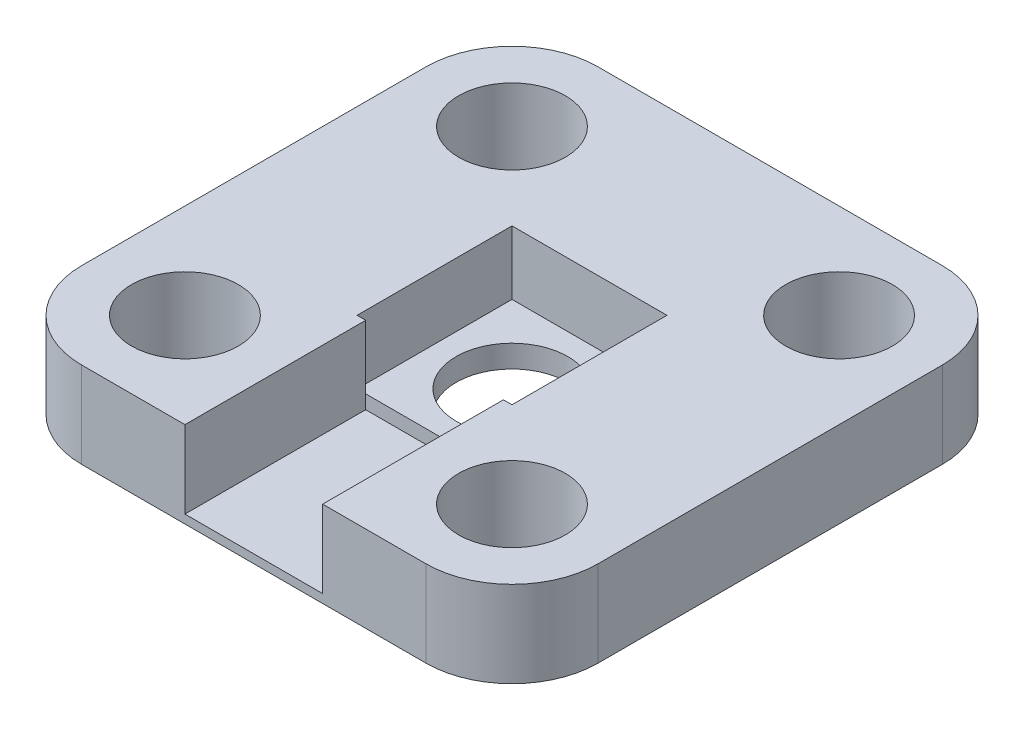
ISO-10303-21;
HEADER;
FILE_DESCRIPTION(('STEP AP214'),'2;1');
FILE_NAME('part.step','',(''),(''),'','','');
FILE_SCHEMA(('AUTOMOTIVE_DESIGN { 1 0 10303 214 1 1 1 1 }'));
ENDSEC;
DATA;
#1=APPLICATION_CONTEXT('core data for automotive mechanical design processes');
#2=APPLICATION_PROTOCOL_DEFINITION('international standard','automotive_design',2000,#1);
#3=PRODUCT_CONTEXT('',#1,'mechanical');
#4=PRODUCT('Part','Part','',(#3));
#5=PRODUCT_RELATED_PRODUCT_CATEGORY('part','',(#4));
#6=PRODUCT_DEFINITION_FORMATION('','',#4);
#7=PRODUCT_DEFINITION_CONTEXT('part definition',#1,'design');
#8=PRODUCT_DEFINITION('design','',#6,#7);
#9=PRODUCT_DEFINITION_SHAPE('','',#8);
#10=(LENGTH_UNIT() NAMED_UNIT(*) SI_UNIT(.MILLI.,.METRE.));
#11=(NAMED_UNIT(*) PLANE_ANGLE_UNIT() SI_UNIT($,.RADIAN.));
#12=(NAMED_UNIT(*) SI_UNIT($,.STERADIAN.) SOLID_ANGLE_UNIT());
#13=UNCERTAINTY_MEASURE_WITH_UNIT(LENGTH_MEASURE(1.E-05),#10,'distance_accuracy_value','');
#14=(GEOMETRIC_REPRESENTATION_CONTEXT(3) GLOBAL_UNCERTAINTY_ASSIGNED_CONTEXT((#13)) GLOBAL_UNIT_ASSIGNED_CONTEXT((#10,
#11,#12)) REPRESENTATION_CONTEXT('',''));
#15=CARTESIAN_POINT('',(0.,0.,0.));
#16=DIRECTION('',(0.,0.,1.));
#17=DIRECTION('',(1.,0.,0.));
#18=AXIS2_PLACEMENT_3D('',#15,#16,#17);
#19=CARTESIAN_POINT('',(0.,2.5,2.25));
#20=DIRECTION('',(0.,0.,-1.));
#21=DIRECTION('',(-1.,0.,0.));
#22=AXIS2_PLACEMENT_3D('',#19,#20,#21);
#23=PLANE('',#22);
#24=DIRECTION('',(1.,0.,0.));
#25=VECTOR('',#24,1.);
#26=CARTESIAN_POINT('',(0.,0.65,2.25));
#27=LINE('',#26,#25);
#28=CARTESIAN_POINT('',(2.,0.65,2.25));
#29=VERTEX_POINT('',#28);
#30=CARTESIAN_POINT('',(2.25,0.65,2.25));
#31=VERTEX_POINT('',#30);
#32=EDGE_CURVE('E164',#29,#31,#27,.T.);
#33=ORIENTED_EDGE('',*,*,#32,.F.);
#34=DIRECTION('',(0.,-1.,0.));
#35=VECTOR('',#34,1.);
#36=CARTESIAN_POINT('',(2.,2.5,2.25));
#37=LINE('',#36,#35);
#38=CARTESIAN_POINT('',(2.,2.5,2.25));
#39=VERTEX_POINT('',#38);
#40=EDGE_CURVE('E200',#39,#29,#37,.T.);
#41=ORIENTED_EDGE('',*,*,#40,.F.);
#42=DIRECTION('',(1.,0.,0.));
#43=VECTOR('',#42,1.);
#44=CARTESIAN_POINT('',(0.,2.5,2.25));
#45=LINE('',#44,#43);
#46=CARTESIAN_POINT('',(2.25,2.5,2.25));
#47=VERTEX_POINT('',#46);
#48=EDGE_CURVE('E283',#39,#47,#45,.T.);
#49=ORIENTED_EDGE('',*,*,#48,.T.);
#50=DIRECTION('',(0.,-1.,0.));
#51=VECTOR('',#50,1.);
#52=CARTESIAN_POINT('',(2.25,2.5,2.25));
#53=LINE('',#52,#51);
#54=EDGE_CURVE('E183',#47,#31,#53,.T.);
#55=ORIENTED_EDGE('',*,*,#54,.T.);
#56=EDGE_LOOP('',(#33,#41,#49,#55));
#57=FACE_BOUND('',#56,.T.);
#58=ADVANCED_FACE('F38',(#57),#23,.T.);
#59=CARTESIAN_POINT('',(2.,2.5,0.));
#60=DIRECTION('',(1.,0.,0.));
#61=DIRECTION('',(0.,0.,-1.));
#62=AXIS2_PLACEMENT_3D('',#59,#60,#61);
#63=PLANE('',#62);
#64=DIRECTION('',(0.,1.,0.));
#65=VECTOR('',#64,1.);
#66=CARTESIAN_POINT('',(2.,2.5,2.25));
#67=LINE('',#66,#65);
#68=CARTESIAN_POINT('',(2.,0.25,2.25));
#69=VERTEX_POINT('',#68);
#70=EDGE_CURVE('E275',#69,#29,#67,.T.);
#71=ORIENTED_EDGE('',*,*,#70,.F.);
#72=DIRECTION('',(0.,0.,1.));
#73=VECTOR('',#72,1.);
#74=CARTESIAN_POINT('',(2.,0.25,0.));
#75=LINE('',#74,#73);
#76=CARTESIAN_POINT('',(2.,0.25,7.5));
#77=VERTEX_POINT('',#76);
#78=EDGE_CURVE('E390',#69,#77,#75,.T.);
#79=ORIENTED_EDGE('',*,*,#78,.T.);
#80=DIRECTION('',(0.,-1.,0.));
#81=VECTOR('',#80,1.);
#82=CARTESIAN_POINT('',(2.,2.5,7.5));
#83=LINE('',#82,#81);
#84=CARTESIAN_POINT('',(2.,2.5,7.5));
#85=VERTEX_POINT('',#84);
#86=EDGE_CURVE('E197',#85,#77,#83,.T.);
#87=ORIENTED_EDGE('',*,*,#86,.F.);
#88=DIRECTION('',(0.,0.,1.));
#89=VECTOR('',#88,1.);
#90=CARTESIAN_POINT('',(2.,2.5,0.));
#91=LINE('',#90,#89);
#92=EDGE_CURVE('E286',#39,#85,#91,.T.);
#93=ORIENTED_EDGE('',*,*,#92,.F.);
#94=ORIENTED_EDGE('',*,*,#40,.T.);
#95=EDGE_LOOP('',(#71,#79,#87,#93,#94));
#96=FACE_BOUND('',#95,.T.);
#97=ADVANCED_FACE('F335',(#96),#63,.F.);
#98=CARTESIAN_POINT('',(7.5,2.5,0.));
#99=DIRECTION('',(1.,0.,0.));
#100=DIRECTION('',(0.,0.,-1.));
#101=AXIS2_PLACEMENT_3D('',#98,#99,#100);
#102=PLANE('',#101);
#103=DIRECTION('',(0.,0.,1.));
#104=VECTOR('',#103,1.);
#105=CARTESIAN_POINT('',(7.5,0.,0.));
#106=LINE('',#105,#104);
#107=CARTESIAN_POINT('',(7.5,0.,-5.));
#108=VERTEX_POINT('',#107);
#109=CARTESIAN_POINT('',(7.5,0.,5.));
#110=VERTEX_POINT('',#109);
#111=EDGE_CURVE('E238',#108,#110,#106,.T.);
#112=ORIENTED_EDGE('',*,*,#111,.F.);
#113=DIRECTION('',(0.,-1.,0.));
#114=VECTOR('',#113,1.);
#115=CARTESIAN_POINT('',(7.5,2.5,-5.));
#116=LINE('',#115,#114);
#117=CARTESIAN_POINT('',(7.5,2.5,-5.));
#118=VERTEX_POINT('',#117);
#119=EDGE_CURVE('E11',#108,#118,#116,.F.);
#120=ORIENTED_EDGE('',*,*,#119,.T.);
#121=DIRECTION('',(0.,0.,1.));
#122=VECTOR('',#121,1.);
#123=CARTESIAN_POINT('',(7.5,2.5,0.));
#124=LINE('',#123,#122);
#125=CARTESIAN_POINT('',(7.5,2.5,5.));
#126=VERTEX_POINT('',#125);
#127=EDGE_CURVE('E240',#118,#126,#124,.T.);
#128=ORIENTED_EDGE('',*,*,#127,.T.);
#129=DIRECTION('',(0.,-1.,0.));
#130=VECTOR('',#129,1.);
#131=CARTESIAN_POINT('',(7.5,0.,5.));
#132=LINE('',#131,#130);
#133=EDGE_CURVE('E46',#126,#110,#132,.T.);
#134=ORIENTED_EDGE('',*,*,#133,.T.);
#135=EDGE_LOOP('',(#112,#120,#128,#134));
#136=FACE_BOUND('',#135,.T.);
#137=ADVANCED_FACE('F237',(#136),#102,.T.);
#138=CARTESIAN_POINT('',(0.,2.5,-7.5));
#139=DIRECTION('',(0.,0.,-1.));
#140=DIRECTION('',(-1.,0.,0.));
#141=AXIS2_PLACEMENT_3D('',#138,#139,#140);
#142=PLANE('',#141);
#143=DIRECTION('',(1.,0.,0.));
#144=VECTOR('',#143,1.);
#145=CARTESIAN_POINT('',(0.,0.,-7.5));
#146=LINE('',#145,#144);
#147=CARTESIAN_POINT('',(-5.,0.,-7.5));
#148=VERTEX_POINT('',#147);
#149=CARTESIAN_POINT('',(5.,0.,-7.5));
#150=VERTEX_POINT('',#149);
#151=EDGE_CURVE('E249',#148,#150,#146,.T.);
#152=ORIENTED_EDGE('',*,*,#151,.F.);
#153=DIRECTION('',(0.,-1.,0.));
#154=VECTOR('',#153,1.);
#155=CARTESIAN_POINT('',(-5.,2.5,-7.5));
#156=LINE('',#155,#154);
#157=CARTESIAN_POINT('',(-5.,2.5,-7.5));
#158=VERTEX_POINT('',#157);
#159=EDGE_CURVE('E60',#148,#158,#156,.F.);
#160=ORIENTED_EDGE('',*,*,#159,.T.);
#161=DIRECTION('',(1.,0.,0.));
#162=VECTOR('',#161,1.);
#163=CARTESIAN_POINT('',(0.,2.5,-7.5));
#164=LINE('',#163,#162);
#165=CARTESIAN_POINT('',(5.,2.5,-7.5));
#166=VERTEX_POINT('',#165);
#167=EDGE_CURVE('E295',#158,#166,#164,.T.);
#168=ORIENTED_EDGE('',*,*,#167,.T.);
#169=DIRECTION('',(0.,-1.,0.));
#170=VECTOR('',#169,1.);
#171=CARTESIAN_POINT('',(5.,2.5,-7.5));
#172=LINE('',#171,#170);
#173=EDGE_CURVE('E228',#166,#150,#172,.T.);
#174=ORIENTED_EDGE('',*,*,#173,.T.);
#175=EDGE_LOOP('',(#152,#160,#168,#174));
#176=FACE_BOUND('',#175,.T.);
#177=ADVANCED_FACE('F507',(#176),#142,.T.);
#178=CARTESIAN_POINT('',(-7.5,2.5,0.));
#179=DIRECTION('',(1.,0.,0.));
#180=DIRECTION('',(0.,0.,-1.));
#181=AXIS2_PLACEMENT_3D('',#178,#179,#180);
#182=PLANE('',#181);
#183=DIRECTION('',(0.,0.,1.));
#184=VECTOR('',#183,1.);
#185=CARTESIAN_POINT('',(-7.5,0.,0.));
#186=LINE('',#185,#184);
#187=CARTESIAN_POINT('',(-7.5,0.,-5.));
#188=VERTEX_POINT('',#187);
#189=CARTESIAN_POINT('',(-7.5,0.,5.));
#190=VERTEX_POINT('',#189);
#191=EDGE_CURVE('E252',#188,#190,#186,.T.);
#192=ORIENTED_EDGE('',*,*,#191,.T.);
#193=DIRECTION('',(0.,-1.,0.));
#194=VECTOR('',#193,1.);
#195=CARTESIAN_POINT('',(-7.5,2.5,5.));
#196=LINE('',#195,#194);
#197=CARTESIAN_POINT('',(-7.5,2.5,5.));
#198=VERTEX_POINT('',#197);
#199=EDGE_CURVE('E219',#190,#198,#196,.F.);
#200=ORIENTED_EDGE('',*,*,#199,.T.);
#201=DIRECTION('',(0.,0.,1.));
#202=VECTOR('',#201,1.);
#203=CARTESIAN_POINT('',(-7.5,2.5,0.));
#204=LINE('',#203,#202);
#205=CARTESIAN_POINT('',(-7.5,2.5,-5.));
#206=VERTEX_POINT('',#205);
#207=EDGE_CURVE('E297',#206,#198,#204,.T.);
#208=ORIENTED_EDGE('',*,*,#207,.F.);
#209=DIRECTION('',(0.,-1.,0.));
#210=VECTOR('',#209,1.);
#211=CARTESIAN_POINT('',(-7.5,0.,-5.));
#212=LINE('',#211,#210);
#213=EDGE_CURVE('E216',#206,#188,#212,.T.);
#214=ORIENTED_EDGE('',*,*,#213,.T.);
#215=EDGE_LOOP('',(#192,#200,#208,#214));
#216=FACE_BOUND('',#215,.T.);
#217=ADVANCED_FACE('F496',(#216),#182,.F.);
#218=CARTESIAN_POINT('',(0.,2.5,7.5));
#219=DIRECTION('',(0.,0.,-1.));
#220=DIRECTION('',(-1.,0.,0.));
#221=AXIS2_PLACEMENT_3D('',#218,#219,#220);
#222=PLANE('',#221);
#223=DIRECTION('',(1.,0.,0.));
#224=VECTOR('',#223,1.);
#225=CARTESIAN_POINT('',(0.,2.5,7.5));
#226=LINE('',#225,#224);
#227=CARTESIAN_POINT('',(-5.,2.5,7.5));
#228=VERTEX_POINT('',#227);
#229=CARTESIAN_POINT('',(-2.,2.5,7.5));
#230=VERTEX_POINT('',#229);
#231=EDGE_CURVE('E293',#228,#230,#226,.T.);
#232=ORIENTED_EDGE('',*,*,#231,.F.);
#233=DIRECTION('',(0.,-1.,0.));
#234=VECTOR('',#233,1.);
#235=CARTESIAN_POINT('',(-5.,2.5,7.5));
#236=LINE('',#235,#234);
#237=CARTESIAN_POINT('',(-5.,0.,7.5));
#238=VERTEX_POINT('',#237);
#239=EDGE_CURVE('E205',#228,#238,#236,.T.);
#240=ORIENTED_EDGE('',*,*,#239,.T.);
#241=DIRECTION('',(1.,0.,0.));
#242=VECTOR('',#241,1.);
#243=CARTESIAN_POINT('',(0.,0.,7.5));
#244=LINE('',#243,#242);
#245=CARTESIAN_POINT('',(5.,0.,7.5));
#246=VERTEX_POINT('',#245);
#247=EDGE_CURVE('E258',#238,#246,#244,.T.);
#248=ORIENTED_EDGE('',*,*,#247,.T.);
#249=DIRECTION('',(0.,-1.,0.));
#250=VECTOR('',#249,1.);
#251=CARTESIAN_POINT('',(5.,2.5,7.5));
#252=LINE('',#251,#250);
#253=CARTESIAN_POINT('',(5.,2.5,7.5));
#254=VERTEX_POINT('',#253);
#255=EDGE_CURVE('E203',#246,#254,#252,.F.);
#256=ORIENTED_EDGE('',*,*,#255,.T.);
#257=EDGE_CURVE('E290',#85,#254,#226,.T.);
#258=ORIENTED_EDGE('',*,*,#257,.F.);
#259=ORIENTED_EDGE('',*,*,#86,.T.);
#260=DIRECTION('',(1.,0.,0.));
#261=VECTOR('',#260,1.);
#262=CARTESIAN_POINT('',(0.,0.25,7.5));
#263=LINE('',#262,#261);
#264=CARTESIAN_POINT('',(-2.,0.25,7.5));
#265=VERTEX_POINT('',#264);
#266=EDGE_CURVE('E380',#265,#77,#263,.T.);
#267=ORIENTED_EDGE('',*,*,#266,.F.);
#268=DIRECTION('',(0.,-1.,0.));
#269=VECTOR('',#268,1.);
#270=CARTESIAN_POINT('',(-2.,2.5,7.5));
#271=LINE('',#270,#269);
#272=EDGE_CURVE('E195',#230,#265,#271,.T.);
#273=ORIENTED_EDGE('',*,*,#272,.F.);
#274=EDGE_LOOP('',(#232,#240,#248,#256,#258,#259,#267,#273));
#275=FACE_BOUND('',#274,.T.);
#276=ADVANCED_FACE('F355',(#275),#222,.F.);
#277=CARTESIAN_POINT('',(-2.,2.5,0.));
#278=DIRECTION('',(-1.,0.,0.));
#279=DIRECTION('',(0.,0.,1.));
#280=AXIS2_PLACEMENT_3D('',#277,#278,#279);
#281=PLANE('',#280);
#282=ORIENTED_EDGE('',*,*,#272,.T.);
#283=DIRECTION('',(0.,0.,-1.));
#284=VECTOR('',#283,1.);
#285=CARTESIAN_POINT('',(-2.,0.25,0.));
#286=LINE('',#285,#284);
#287=CARTESIAN_POINT('',(-2.,0.25,2.25));
#288=VERTEX_POINT('',#287);
#289=EDGE_CURVE('E374',#265,#288,#286,.T.);
#290=ORIENTED_EDGE('',*,*,#289,.T.);
#291=DIRECTION('',(0.,-1.,0.));
#292=VECTOR('',#291,1.);
#293=CARTESIAN_POINT('',(-2.,2.5,2.25));
#294=LINE('',#293,#292);
#295=CARTESIAN_POINT('',(-2.,0.65,2.25));
#296=VERTEX_POINT('',#295);
#297=EDGE_CURVE('E364',#296,#288,#294,.T.);
#298=ORIENTED_EDGE('',*,*,#297,.F.);
#299=DIRECTION('',(0.,-1.,0.));
#300=VECTOR('',#299,1.);
#301=CARTESIAN_POINT('',(-2.,2.5,2.25));
#302=LINE('',#301,#300);
#303=CARTESIAN_POINT('',(-2.,2.5,2.25));
#304=VERTEX_POINT('',#303);
#305=EDGE_CURVE('E192',#304,#296,#302,.T.);
#306=ORIENTED_EDGE('',*,*,#305,.F.);
#307=DIRECTION('',(0.,0.,-1.));
#308=VECTOR('',#307,1.);
#309=CARTESIAN_POINT('',(-2.,2.5,0.));
#310=LINE('',#309,#308);
#311=EDGE_CURVE('E300',#230,#304,#310,.T.);
#312=ORIENTED_EDGE('',*,*,#311,.F.);
#313=EDGE_LOOP('',(#282,#290,#298,#306,#312));
#314=FACE_BOUND('',#313,.T.);
#315=ADVANCED_FACE('F348',(#314),#281,.F.);
#316=CARTESIAN_POINT('',(-2.25,0.65,2.25));
#317=VERTEX_POINT('',#316);
#318=EDGE_CURVE('E359',#317,#296,#27,.T.);
#319=ORIENTED_EDGE('',*,*,#318,.F.);
#320=DIRECTION('',(0.,-1.,0.));
#321=VECTOR('',#320,1.);
#322=CARTESIAN_POINT('',(-2.25,2.5,2.25));
#323=LINE('',#322,#321);
#324=CARTESIAN_POINT('',(-2.25,2.5,2.25));
#325=VERTEX_POINT('',#324);
#326=EDGE_CURVE('E185',#325,#317,#323,.T.);
#327=ORIENTED_EDGE('',*,*,#326,.F.);
#328=EDGE_CURVE('E287',#325,#304,#45,.T.);
#329=ORIENTED_EDGE('',*,*,#328,.T.);
#330=ORIENTED_EDGE('',*,*,#305,.T.);
#331=EDGE_LOOP('',(#319,#327,#329,#330));
#332=FACE_BOUND('',#331,.T.);
#333=ADVANCED_FACE('F338',(#332),#23,.T.);
#334=CARTESIAN_POINT('',(-2.25,2.5,0.));
#335=DIRECTION('',(1.,0.,0.));
#336=DIRECTION('',(0.,0.,-1.));
#337=AXIS2_PLACEMENT_3D('',#334,#335,#336);
#338=PLANE('',#337);
#339=DIRECTION('',(0.,0.,1.));
#340=VECTOR('',#339,1.);
#341=CARTESIAN_POINT('',(-2.25,0.65,0.));
#342=LINE('',#341,#340);
#343=CARTESIAN_POINT('',(-2.25,0.65,-2.25));
#344=VERTEX_POINT('',#343);
#345=EDGE_CURVE('E178',#344,#317,#342,.T.);
#346=ORIENTED_EDGE('',*,*,#345,.F.);
#347=DIRECTION('',(0.,-1.,0.));
#348=VECTOR('',#347,1.);
#349=CARTESIAN_POINT('',(-2.25,2.5,-2.25));
#350=LINE('',#349,#348);
#351=CARTESIAN_POINT('',(-2.25,2.5,-2.25));
#352=VERTEX_POINT('',#351);
#353=EDGE_CURVE('E177',#352,#344,#350,.T.);
#354=ORIENTED_EDGE('',*,*,#353,.F.);
#355=DIRECTION('',(0.,0.,1.));
#356=VECTOR('',#355,1.);
#357=CARTESIAN_POINT('',(-2.25,2.5,0.));
#358=LINE('',#357,#356);
#359=EDGE_CURVE('E302',#352,#325,#358,.T.);
#360=ORIENTED_EDGE('',*,*,#359,.T.);
#361=ORIENTED_EDGE('',*,*,#326,.T.);
#362=EDGE_LOOP('',(#346,#354,#360,#361));
#363=FACE_BOUND('',#362,.T.);
#364=ADVANCED_FACE('F347',(#363),#338,.T.);
#365=CARTESIAN_POINT('',(0.,2.5,-2.25));
#366=DIRECTION('',(0.,0.,-1.));
#367=DIRECTION('',(-1.,0.,0.));
#368=AXIS2_PLACEMENT_3D('',#365,#366,#367);
#369=PLANE('',#368);
#370=ORIENTED_EDGE('',*,*,#353,.T.);
#371=DIRECTION('',(1.,0.,0.));
#372=VECTOR('',#371,1.);
#373=CARTESIAN_POINT('',(0.,0.65,-2.25));
#374=LINE('',#373,#372);
#375=CARTESIAN_POINT('',(2.25,0.65,-2.25));
#376=VERTEX_POINT('',#375);
#377=EDGE_CURVE('E160',#344,#376,#374,.T.);
#378=ORIENTED_EDGE('',*,*,#377,.T.);
#379=DIRECTION('',(0.,-1.,0.));
#380=VECTOR('',#379,1.);
#381=CARTESIAN_POINT('',(2.25,2.5,-2.25));
#382=LINE('',#381,#380);
#383=CARTESIAN_POINT('',(2.25,2.5,-2.25));
#384=VERTEX_POINT('',#383);
#385=EDGE_CURVE('E176',#384,#376,#382,.T.);
#386=ORIENTED_EDGE('',*,*,#385,.F.);
#387=DIRECTION('',(1.,0.,0.));
#388=VECTOR('',#387,1.);
#389=CARTESIAN_POINT('',(0.,2.5,-2.25));
#390=LINE('',#389,#388);
#391=EDGE_CURVE('E305',#352,#384,#390,.T.);
#392=ORIENTED_EDGE('',*,*,#391,.F.);
#393=EDGE_LOOP('',(#370,#378,#386,#392));
#394=FACE_BOUND('',#393,.T.);
#395=ADVANCED_FACE('F174',(#394),#369,.F.);
#396=CARTESIAN_POINT('',(-4.75,2.5,-4.75));
#397=DIRECTION('',(0.,-1.,0.));
#398=DIRECTION('',(0.,0.,-1.));
#399=AXIS2_PLACEMENT_3D('',#396,#397,#398);
#400=CYLINDRICAL_SURFACE('',#399,1.55);
#401=CARTESIAN_POINT('',(-4.75,2.5,-4.75));
#402=DIRECTION('',(0.,1.,0.));
#403=DIRECTION('',(0.,0.,1.));
#404=AXIS2_PLACEMENT_3D('',#401,#402,#403);
#405=CIRCLE('',#404,1.55);
#406=CARTESIAN_POINT('',(-4.75,2.5,-3.2));
#407=VERTEX_POINT('',#406);
#408=EDGE_CURVE('E280',#407,#407,#405,.T.);
#409=ORIENTED_EDGE('',*,*,#408,.T.);
#410=EDGE_LOOP('',(#409));
#411=FACE_BOUND('',#410,.T.);
#412=CARTESIAN_POINT('',(-4.75,0.,-4.75));
#413=DIRECTION('',(0.,1.,0.));
#414=DIRECTION('',(0.,0.,1.));
#415=AXIS2_PLACEMENT_3D('',#412,#413,#414);
#416=CIRCLE('',#415,1.55);
#417=CARTESIAN_POINT('',(-4.75,0.,-3.2));
#418=VERTEX_POINT('',#417);
#419=EDGE_CURVE('E250',#418,#418,#416,.T.);
#420=ORIENTED_EDGE('',*,*,#419,.F.);
#421=EDGE_LOOP('',(#420));
#422=FACE_BOUND('',#421,.T.);
#423=ADVANCED_FACE('F322',(#411,#422),#400,.F.);
#424=CARTESIAN_POINT('',(4.75,2.5,-4.75));
#425=DIRECTION('',(0.,-1.,0.));
#426=DIRECTION('',(0.,0.,-1.));
#427=AXIS2_PLACEMENT_3D('',#424,#425,#426);
#428=CYLINDRICAL_SURFACE('',#427,1.55);
#429=CARTESIAN_POINT('',(4.75,2.5,-4.75));
#430=DIRECTION('',(0.,1.,0.));
#431=DIRECTION('',(0.,0.,1.));
#432=AXIS2_PLACEMENT_3D('',#429,#430,#431);
#433=CIRCLE('',#432,1.55);
#434=CARTESIAN_POINT('',(4.75,2.5,-3.2));
#435=VERTEX_POINT('',#434);
#436=EDGE_CURVE('E272',#435,#435,#433,.T.);
#437=ORIENTED_EDGE('',*,*,#436,.T.);
#438=EDGE_LOOP('',(#437));
#439=FACE_BOUND('',#438,.T.);
#440=CARTESIAN_POINT('',(4.75,0.,-4.75));
#441=DIRECTION('',(0.,1.,0.));
#442=DIRECTION('',(0.,0.,1.));
#443=AXIS2_PLACEMENT_3D('',#440,#441,#442);
#444=CIRCLE('',#443,1.55);
#445=CARTESIAN_POINT('',(4.75,0.,-3.2));
#446=VERTEX_POINT('',#445);
#447=EDGE_CURVE('E255',#446,#446,#444,.T.);
#448=ORIENTED_EDGE('',*,*,#447,.F.);
#449=EDGE_LOOP('',(#448));
#450=FACE_BOUND('',#449,.T.);
#451=ADVANCED_FACE('F319',(#439,#450),#428,.F.);
#452=CARTESIAN_POINT('',(4.75,2.5,4.75));
#453=DIRECTION('',(0.,-1.,0.));
#454=DIRECTION('',(0.,0.,-1.));
#455=AXIS2_PLACEMENT_3D('',#452,#453,#454);
#456=CYLINDRICAL_SURFACE('',#455,1.55);
#457=CARTESIAN_POINT('',(4.75,2.5,4.75));
#458=DIRECTION('',(0.,1.,0.));
#459=DIRECTION('',(0.,0.,1.));
#460=AXIS2_PLACEMENT_3D('',#457,#458,#459);
#461=CIRCLE('',#460,1.55);
#462=CARTESIAN_POINT('',(4.75,2.5,6.3));
#463=VERTEX_POINT('',#462);
#464=EDGE_CURVE('E267',#463,#463,#461,.T.);
#465=ORIENTED_EDGE('',*,*,#464,.T.);
#466=EDGE_LOOP('',(#465));
#467=FACE_BOUND('',#466,.T.);
#468=CARTESIAN_POINT('',(4.75,0.,4.75));
#469=DIRECTION('',(0.,1.,0.));
#470=DIRECTION('',(0.,0.,1.));
#471=AXIS2_PLACEMENT_3D('',#468,#469,#470);
#472=CIRCLE('',#471,1.55);
#473=CARTESIAN_POINT('',(4.75,0.,6.3));
#474=VERTEX_POINT('',#473);
#475=EDGE_CURVE('E311',#474,#474,#472,.T.);
#476=ORIENTED_EDGE('',*,*,#475,.F.);
#477=EDGE_LOOP('',(#476));
#478=FACE_BOUND('',#477,.T.);
#479=ADVANCED_FACE('F321',(#467,#478),#456,.F.);
#480=CARTESIAN_POINT('',(-4.75,2.5,4.75));
#481=DIRECTION('',(0.,-1.,0.));
#482=DIRECTION('',(0.,0.,-1.));
#483=AXIS2_PLACEMENT_3D('',#480,#481,#482);
#484=CYLINDRICAL_SURFACE('',#483,1.55);
#485=CARTESIAN_POINT('',(-4.75,2.5,4.75));
#486=DIRECTION('',(0.,1.,0.));
#487=DIRECTION('',(0.,0.,1.));
#488=AXIS2_PLACEMENT_3D('',#485,#486,#487);
#489=CIRCLE('',#488,1.55);
#490=CARTESIAN_POINT('',(-4.75,2.5,6.3));
#491=VERTEX_POINT('',#490);
#492=EDGE_CURVE('E263',#491,#491,#489,.T.);
#493=ORIENTED_EDGE('',*,*,#492,.T.);
#494=EDGE_LOOP('',(#493));
#495=FACE_BOUND('',#494,.T.);
#496=CARTESIAN_POINT('',(-4.75,0.,4.75));
#497=DIRECTION('',(0.,1.,0.));
#498=DIRECTION('',(0.,0.,1.));
#499=AXIS2_PLACEMENT_3D('',#496,#497,#498);
#500=CIRCLE('',#499,1.55);
#501=CARTESIAN_POINT('',(-4.75,0.,6.3));
#502=VERTEX_POINT('',#501);
#503=EDGE_CURVE('E308',#502,#502,#500,.T.);
#504=ORIENTED_EDGE('',*,*,#503,.F.);
#505=EDGE_LOOP('',(#504));
#506=FACE_BOUND('',#505,.T.);
#507=ADVANCED_FACE('F329',(#495,#506),#484,.F.);
#508=CARTESIAN_POINT('',(2.25,2.5,0.));
#509=DIRECTION('',(1.,0.,0.));
#510=DIRECTION('',(0.,0.,-1.));
#511=AXIS2_PLACEMENT_3D('',#508,#509,#510);
#512=PLANE('',#511);
#513=ORIENTED_EDGE('',*,*,#385,.T.);
#514=DIRECTION('',(0.,0.,1.));
#515=VECTOR('',#514,1.);
#516=CARTESIAN_POINT('',(2.25,0.65,0.));
#517=LINE('',#516,#515);
#518=EDGE_CURVE('E157',#376,#31,#517,.T.);
#519=ORIENTED_EDGE('',*,*,#518,.T.);
#520=ORIENTED_EDGE('',*,*,#54,.F.);
#521=DIRECTION('',(0.,0.,1.));
#522=VECTOR('',#521,1.);
#523=CARTESIAN_POINT('',(2.25,2.5,0.));
#524=LINE('',#523,#522);
#525=EDGE_CURVE('E181',#384,#47,#524,.T.);
#526=ORIENTED_EDGE('',*,*,#525,.F.);
#527=EDGE_LOOP('',(#513,#519,#520,#526));
#528=FACE_BOUND('',#527,.T.);
#529=ADVANCED_FACE('F180',(#528),#512,.F.);
#530=CARTESIAN_POINT('',(0.,2.5,0.));
#531=DIRECTION('',(0.,1.,0.));
#532=DIRECTION('',(0.,0.,1.));
#533=AXIS2_PLACEMENT_3D('',#530,#531,#532);
#534=PLANE('',#533);
#535=ORIENTED_EDGE('',*,*,#492,.F.);
#536=EDGE_LOOP('',(#535));
#537=FACE_BOUND('',#536,.T.);
#538=ORIENTED_EDGE('',*,*,#464,.F.);
#539=EDGE_LOOP('',(#538));
#540=FACE_BOUND('',#539,.T.);
#541=ORIENTED_EDGE('',*,*,#436,.F.);
#542=EDGE_LOOP('',(#541));
#543=FACE_BOUND('',#542,.T.);
#544=ORIENTED_EDGE('',*,*,#408,.F.);
#545=EDGE_LOOP('',(#544));
#546=FACE_BOUND('',#545,.T.);
#547=ORIENTED_EDGE('',*,*,#207,.T.);
#548=CARTESIAN_POINT('',(-5.,2.5,5.));
#549=DIRECTION('',(0.,1.,0.));
#550=DIRECTION('',(0.,0.,1.));
#551=AXIS2_PLACEMENT_3D('',#548,#549,#550);
#552=CIRCLE('',#551,2.5);
#553=EDGE_CURVE('E226',#198,#228,#552,.T.);
#554=ORIENTED_EDGE('',*,*,#553,.T.);
#555=ORIENTED_EDGE('',*,*,#231,.T.);
#556=ORIENTED_EDGE('',*,*,#311,.T.);
#557=ORIENTED_EDGE('',*,*,#328,.F.);
#558=ORIENTED_EDGE('',*,*,#359,.F.);
#559=ORIENTED_EDGE('',*,*,#391,.T.);
#560=ORIENTED_EDGE('',*,*,#525,.T.);
#561=ORIENTED_EDGE('',*,*,#48,.F.);
#562=ORIENTED_EDGE('',*,*,#92,.T.);
#563=ORIENTED_EDGE('',*,*,#257,.T.);
#564=CARTESIAN_POINT('',(5.,2.5,5.));
#565=DIRECTION('',(0.,1.,0.));
#566=DIRECTION('',(0.,0.,1.));
#567=AXIS2_PLACEMENT_3D('',#564,#565,#566);
#568=CIRCLE('',#567,2.5);
#569=EDGE_CURVE('E221',#254,#126,#568,.T.);
#570=ORIENTED_EDGE('',*,*,#569,.T.);
#571=ORIENTED_EDGE('',*,*,#127,.F.);
#572=CARTESIAN_POINT('',(5.,2.5,-5.));
#573=DIRECTION('',(0.,1.,0.));
#574=DIRECTION('',(0.,0.,1.));
#575=AXIS2_PLACEMENT_3D('',#572,#573,#574);
#576=CIRCLE('',#575,2.5);
#577=EDGE_CURVE('E53',#118,#166,#576,.T.);
#578=ORIENTED_EDGE('',*,*,#577,.T.);
#579=ORIENTED_EDGE('',*,*,#167,.F.);
#580=CARTESIAN_POINT('',(-5.,2.5,-5.));
#581=DIRECTION('',(0.,1.,0.));
#582=DIRECTION('',(0.,0.,1.));
#583=AXIS2_PLACEMENT_3D('',#580,#581,#582);
#584=CIRCLE('',#583,2.5);
#585=EDGE_CURVE('E224',#158,#206,#584,.T.);
#586=ORIENTED_EDGE('',*,*,#585,.T.);
#587=EDGE_LOOP('',(#547,#554,#555,#556,#557,#558,#559,#560,#561,#562,#563,#570,#571,#578,#579,#586));
#588=FACE_BOUND('',#587,.T.);
#589=ADVANCED_FACE('F368',(#537,#540,#543,#546,#588),#534,.T.);
#590=CARTESIAN_POINT('',(0.,0.,0.));
#591=DIRECTION('',(0.,1.,0.));
#592=DIRECTION('',(0.,0.,1.));
#593=AXIS2_PLACEMENT_3D('',#590,#591,#592);
#594=PLANE('',#593);
#595=ORIENTED_EDGE('',*,*,#247,.F.);
#596=CARTESIAN_POINT('',(-5.,0.,5.));
#597=DIRECTION('',(0.,1.,0.));
#598=DIRECTION('',(0.,0.,1.));
#599=AXIS2_PLACEMENT_3D('',#596,#597,#598);
#600=CIRCLE('',#599,2.5);
#601=EDGE_CURVE('E214',#238,#190,#600,.F.);
#602=ORIENTED_EDGE('',*,*,#601,.T.);
#603=ORIENTED_EDGE('',*,*,#191,.F.);
#604=CARTESIAN_POINT('',(-5.,0.,-5.));
#605=DIRECTION('',(0.,1.,0.));
#606=DIRECTION('',(0.,0.,1.));
#607=AXIS2_PLACEMENT_3D('',#604,#605,#606);
#608=CIRCLE('',#607,2.5);
#609=EDGE_CURVE('E212',#188,#148,#608,.F.);
#610=ORIENTED_EDGE('',*,*,#609,.T.);
#611=ORIENTED_EDGE('',*,*,#151,.T.);
#612=CARTESIAN_POINT('',(5.,0.,-5.));
#613=DIRECTION('',(0.,1.,0.));
#614=DIRECTION('',(0.,0.,1.));
#615=AXIS2_PLACEMENT_3D('',#612,#613,#614);
#616=CIRCLE('',#615,2.5);
#617=EDGE_CURVE('E210',#150,#108,#616,.F.);
#618=ORIENTED_EDGE('',*,*,#617,.T.);
#619=ORIENTED_EDGE('',*,*,#111,.T.);
#620=CARTESIAN_POINT('',(5.,0.,5.));
#621=DIRECTION('',(0.,1.,0.));
#622=DIRECTION('',(0.,0.,1.));
#623=AXIS2_PLACEMENT_3D('',#620,#621,#622);
#624=CIRCLE('',#623,2.5);
#625=EDGE_CURVE('E208',#110,#246,#624,.F.);
#626=ORIENTED_EDGE('',*,*,#625,.T.);
#627=EDGE_LOOP('',(#595,#602,#603,#610,#611,#618,#619,#626));
#628=FACE_BOUND('',#627,.T.);
#629=ORIENTED_EDGE('',*,*,#503,.T.);
#630=EDGE_LOOP('',(#629));
#631=FACE_BOUND('',#630,.T.);
#632=ORIENTED_EDGE('',*,*,#475,.T.);
#633=EDGE_LOOP('',(#632));
#634=FACE_BOUND('',#633,.T.);
#635=ORIENTED_EDGE('',*,*,#447,.T.);
#636=EDGE_LOOP('',(#635));
#637=FACE_BOUND('',#636,.T.);
#638=ORIENTED_EDGE('',*,*,#419,.T.);
#639=EDGE_LOOP('',(#638));
#640=FACE_BOUND('',#639,.T.);
#641=CARTESIAN_POINT('',(0.,0.,0.));
#642=DIRECTION('',(0.,1.,0.));
#643=DIRECTION('',(0.,0.,1.));
#644=AXIS2_PLACEMENT_3D('',#641,#642,#643);
#645=CIRCLE('',#644,1.625);
#646=CARTESIAN_POINT('',(0.,0.,1.625));
#647=VERTEX_POINT('',#646);
#648=EDGE_CURVE('E378',#647,#647,#645,.T.);
#649=ORIENTED_EDGE('',*,*,#648,.T.);
#650=EDGE_LOOP('',(#649));
#651=FACE_BOUND('',#650,.T.);
#652=ADVANCED_FACE('F245',(#628,#631,#634,#637,#640,#651),#594,.F.);
#653=CARTESIAN_POINT('',(0.,0.65,2.25));
#654=DIRECTION('',(0.,0.,-1.));
#655=DIRECTION('',(-1.,0.,0.));
#656=AXIS2_PLACEMENT_3D('',#653,#654,#655);
#657=PLANE('',#656);
#658=ORIENTED_EDGE('',*,*,#297,.T.);
#659=DIRECTION('',(1.,0.,0.));
#660=VECTOR('',#659,1.);
#661=CARTESIAN_POINT('',(0.,0.25,2.25));
#662=LINE('',#661,#660);
#663=EDGE_CURVE('E388',#288,#69,#662,.T.);
#664=ORIENTED_EDGE('',*,*,#663,.T.);
#665=ORIENTED_EDGE('',*,*,#70,.T.);
#666=EDGE_CURVE('E365',#296,#29,#27,.T.);
#667=ORIENTED_EDGE('',*,*,#666,.F.);
#668=EDGE_LOOP('',(#658,#664,#665,#667));
#669=FACE_BOUND('',#668,.T.);
#670=ADVANCED_FACE('F398',(#669),#657,.F.);
#671=CARTESIAN_POINT('',(0.,0.65,0.));
#672=DIRECTION('',(0.,-1.,0.));
#673=DIRECTION('',(0.,0.,-1.));
#674=AXIS2_PLACEMENT_3D('',#671,#672,#673);
#675=CYLINDRICAL_SURFACE('',#674,1.625);
#676=CARTESIAN_POINT('',(0.,0.65,0.));
#677=DIRECTION('',(0.,1.,0.));
#678=DIRECTION('',(0.,0.,1.));
#679=AXIS2_PLACEMENT_3D('',#676,#677,#678);
#680=CIRCLE('',#679,1.625);
#681=CARTESIAN_POINT('',(0.,0.65,1.625));
#682=VERTEX_POINT('',#681);
#683=EDGE_CURVE('E169',#682,#682,#680,.T.);
#684=ORIENTED_EDGE('',*,*,#683,.T.);
#685=EDGE_LOOP('',(#684));
#686=FACE_BOUND('',#685,.T.);
#687=ORIENTED_EDGE('',*,*,#648,.F.);
#688=EDGE_LOOP('',(#687));
#689=FACE_BOUND('',#688,.T.);
#690=ADVANCED_FACE('F433',(#686,#689),#675,.F.);
#691=CARTESIAN_POINT('',(0.,0.65,0.));
#692=DIRECTION('',(0.,1.,0.));
#693=DIRECTION('',(0.,0.,1.));
#694=AXIS2_PLACEMENT_3D('',#691,#692,#693);
#695=PLANE('',#694);
#696=ORIENTED_EDGE('',*,*,#683,.F.);
#697=EDGE_LOOP('',(#696));
#698=FACE_BOUND('',#697,.T.);
#699=ORIENTED_EDGE('',*,*,#518,.F.);
#700=ORIENTED_EDGE('',*,*,#377,.F.);
#701=ORIENTED_EDGE('',*,*,#345,.T.);
#702=ORIENTED_EDGE('',*,*,#318,.T.);
#703=ORIENTED_EDGE('',*,*,#666,.T.);
#704=ORIENTED_EDGE('',*,*,#32,.T.);
#705=EDGE_LOOP('',(#699,#700,#701,#702,#703,#704));
#706=FACE_BOUND('',#705,.T.);
#707=ADVANCED_FACE('F159',(#698,#706),#695,.T.);
#708=CARTESIAN_POINT('',(0.,0.25,0.));
#709=DIRECTION('',(0.,1.,0.));
#710=DIRECTION('',(0.,0.,1.));
#711=AXIS2_PLACEMENT_3D('',#708,#709,#710);
#712=PLANE('',#711);
#713=ORIENTED_EDGE('',*,*,#78,.F.);
#714=ORIENTED_EDGE('',*,*,#663,.F.);
#715=ORIENTED_EDGE('',*,*,#289,.F.);
#716=ORIENTED_EDGE('',*,*,#266,.T.);
#717=EDGE_LOOP('',(#713,#714,#715,#716));
#718=FACE_BOUND('',#717,.T.);
#719=ADVANCED_FACE('F397',(#718),#712,.T.);
#720=CARTESIAN_POINT('',(-5.,2.5,5.));
#721=DIRECTION('',(0.,-1.,0.));
#722=DIRECTION('',(0.,0.,-1.));
#723=AXIS2_PLACEMENT_3D('',#720,#721,#722);
#724=CYLINDRICAL_SURFACE('',#723,2.5);
#725=ORIENTED_EDGE('',*,*,#553,.F.);
#726=ORIENTED_EDGE('',*,*,#199,.F.);
#727=ORIENTED_EDGE('',*,*,#601,.F.);
#728=ORIENTED_EDGE('',*,*,#239,.F.);
#729=EDGE_LOOP('',(#725,#726,#727,#728));
#730=FACE_BOUND('',#729,.T.);
#731=ADVANCED_FACE('F410',(#730),#724,.T.);
#732=CARTESIAN_POINT('',(-5.,2.5,-5.));
#733=DIRECTION('',(0.,1.,0.));
#734=DIRECTION('',(0.,0.,1.));
#735=AXIS2_PLACEMENT_3D('',#732,#733,#734);
#736=CYLINDRICAL_SURFACE('',#735,2.5);
#737=ORIENTED_EDGE('',*,*,#585,.F.);
#738=ORIENTED_EDGE('',*,*,#159,.F.);
#739=ORIENTED_EDGE('',*,*,#609,.F.);
#740=ORIENTED_EDGE('',*,*,#213,.F.);
#741=EDGE_LOOP('',(#737,#738,#739,#740));
#742=FACE_BOUND('',#741,.T.);
#743=ADVANCED_FACE('F405',(#742),#736,.T.);
#744=CARTESIAN_POINT('',(5.,2.5,-5.));
#745=DIRECTION('',(0.,-1.,0.));
#746=DIRECTION('',(0.,0.,-1.));
#747=AXIS2_PLACEMENT_3D('',#744,#745,#746);
#748=CYLINDRICAL_SURFACE('',#747,2.5);
#749=ORIENTED_EDGE('',*,*,#577,.F.);
#750=ORIENTED_EDGE('',*,*,#119,.F.);
#751=ORIENTED_EDGE('',*,*,#617,.F.);
#752=ORIENTED_EDGE('',*,*,#173,.F.);
#753=EDGE_LOOP('',(#749,#750,#751,#752));
#754=FACE_BOUND('',#753,.T.);
#755=ADVANCED_FACE('F401',(#754),#748,.T.);
#756=CARTESIAN_POINT('',(5.,2.5,5.));
#757=DIRECTION('',(0.,1.,0.));
#758=DIRECTION('',(0.,0.,1.));
#759=AXIS2_PLACEMENT_3D('',#756,#757,#758);
#760=CYLINDRICAL_SURFACE('',#759,2.5);
#761=ORIENTED_EDGE('',*,*,#569,.F.);
#762=ORIENTED_EDGE('',*,*,#255,.F.);
#763=ORIENTED_EDGE('',*,*,#625,.F.);
#764=ORIENTED_EDGE('',*,*,#133,.F.);
#765=EDGE_LOOP('',(#761,#762,#763,#764));
#766=FACE_BOUND('',#765,.T.);
#767=ADVANCED_FACE('F40',(#766),#760,.T.);
#768=CLOSED_SHELL('',(#58,#97,#137,#177,#217,#276,#315,#333,#364,#395,#423,#451,#479,#507,#529,
#589,#652,#670,#690,#707,#719,#731,#743,#755,#767));
#769=MANIFOLD_SOLID_BREP('B2',#768);
#770=ADVANCED_BREP_SHAPE_REPRESENTATION('',(#18,#769),#14);
#771=SHAPE_DEFINITION_REPRESENTATION(#9,#770);
ENDSEC;
END-ISO-10303-21;
